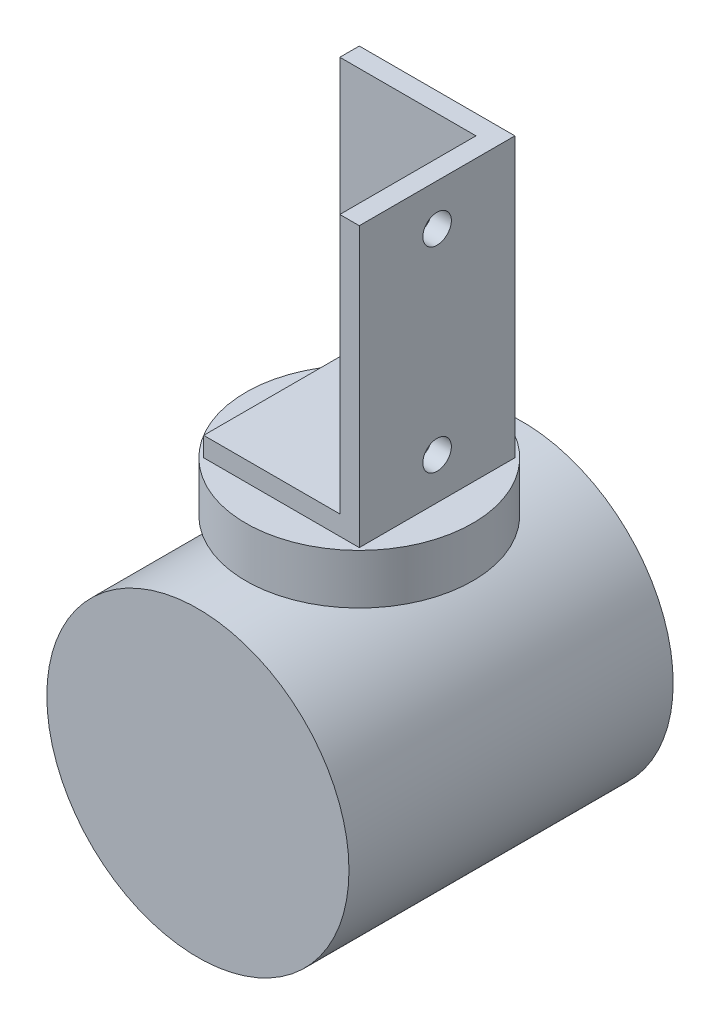
ISO-10303-21;
HEADER;
FILE_DESCRIPTION(('STEP AP214'),'2;1');
FILE_NAME('part.step','',(''),(''),'','','');
FILE_SCHEMA(('AUTOMOTIVE_DESIGN { 1 0 10303 214 1 1 1 1 }'));
ENDSEC;
DATA;
#1=APPLICATION_CONTEXT('core data for automotive mechanical design processes');
#2=APPLICATION_PROTOCOL_DEFINITION('international standard','automotive_design',2000,#1);
#3=PRODUCT_CONTEXT('',#1,'mechanical');
#4=PRODUCT('Part','Part','',(#3));
#5=PRODUCT_RELATED_PRODUCT_CATEGORY('part','',(#4));
#6=PRODUCT_DEFINITION_FORMATION('','',#4);
#7=PRODUCT_DEFINITION_CONTEXT('part definition',#1,'design');
#8=PRODUCT_DEFINITION('design','',#6,#7);
#9=PRODUCT_DEFINITION_SHAPE('','',#8);
#10=(LENGTH_UNIT() NAMED_UNIT(*) SI_UNIT(.MILLI.,.METRE.));
#11=(NAMED_UNIT(*) PLANE_ANGLE_UNIT() SI_UNIT($,.RADIAN.));
#12=(NAMED_UNIT(*) SI_UNIT($,.STERADIAN.) SOLID_ANGLE_UNIT());
#13=UNCERTAINTY_MEASURE_WITH_UNIT(LENGTH_MEASURE(1.E-05),#10,'distance_accuracy_value','');
#14=(GEOMETRIC_REPRESENTATION_CONTEXT(3) GLOBAL_UNCERTAINTY_ASSIGNED_CONTEXT((#13)) GLOBAL_UNIT_ASSIGNED_CONTEXT((#10,
#11,#12)) REPRESENTATION_CONTEXT('',''));
#15=CARTESIAN_POINT('',(0.,0.,0.));
#16=DIRECTION('',(0.,0.,1.));
#17=DIRECTION('',(1.,0.,0.));
#18=AXIS2_PLACEMENT_3D('',#15,#16,#17);
#19=CARTESIAN_POINT('',(0.,-39.37,31.6095157544582));
#20=DIRECTION('',(0.,0.,-1.));
#21=DIRECTION('',(-1.,0.,0.));
#22=AXIS2_PLACEMENT_3D('',#19,#20,#21);
#23=PLANE('',#22);
#24=CARTESIAN_POINT('',(0.,-39.37,31.6095157544582));
#25=DIRECTION('',(0.,0.,-1.));
#26=DIRECTION('',(-1.,0.,0.));
#27=AXIS2_PLACEMENT_3D('',#24,#25,#26);
#28=CIRCLE('',#27,29.591);
#29=CARTESIAN_POINT('',(-29.591,-39.37,31.6095157544582));
#30=VERTEX_POINT('',#29);
#31=EDGE_CURVE('E47',#30,#30,#28,.T.);
#32=ORIENTED_EDGE('',*,*,#31,.F.);
#33=EDGE_LOOP('',(#32));
#34=FACE_BOUND('',#33,.T.);
#35=ADVANCED_FACE('F41',(#34),#23,.F.);
#36=CARTESIAN_POINT('',(0.,-39.37,-31.8904842455418));
#37=DIRECTION('',(0.,0.,1.));
#38=DIRECTION('',(1.,0.,0.));
#39=AXIS2_PLACEMENT_3D('',#36,#37,#38);
#40=PLANE('',#39);
#41=CARTESIAN_POINT('',(0.,-39.37,-31.8904842455418));
#42=DIRECTION('',(0.,0.,-1.));
#43=DIRECTION('',(-1.,0.,0.));
#44=AXIS2_PLACEMENT_3D('',#41,#42,#43);
#45=CIRCLE('',#44,29.591);
#46=CARTESIAN_POINT('',(-29.591,-39.37,-31.8904842455418));
#47=VERTEX_POINT('',#46);
#48=EDGE_CURVE('E11',#47,#47,#45,.T.);
#49=ORIENTED_EDGE('',*,*,#48,.T.);
#50=EDGE_LOOP('',(#49));
#51=FACE_BOUND('',#50,.T.);
#52=ADVANCED_FACE('F56',(#51),#40,.F.);
#53=CARTESIAN_POINT('',(0.,-39.37,-31.8904842455418));
#54=DIRECTION('',(0.,0.,-1.));
#55=DIRECTION('',(-1.,0.,0.));
#56=AXIS2_PLACEMENT_3D('',#53,#54,#55);
#57=CYLINDRICAL_SURFACE('',#56,29.591);
#58=ORIENTED_EDGE('',*,*,#48,.F.);
#59=EDGE_LOOP('',(#58));
#60=FACE_BOUND('',#59,.T.);
#61=ORIENTED_EDGE('',*,*,#31,.T.);
#62=EDGE_LOOP('',(#61));
#63=FACE_BOUND('',#62,.T.);
#64=ADVANCED_FACE('F53',(#60,#63),#57,.T.);
#65=CLOSED_SHELL('',(#35,#52,#64));
#66=MANIFOLD_SOLID_BREP('B2',#65);
#67=CARTESIAN_POINT('',(15.24,3.81,-15.24));
#68=DIRECTION('',(-1.,0.,0.));
#69=DIRECTION('',(0.,0.,1.));
#70=AXIS2_PLACEMENT_3D('',#67,#68,#69);
#71=PLANE('',#70);
#72=CARTESIAN_POINT('',(15.24,8.128,0.));
#73=DIRECTION('',(1.,0.,0.));
#74=DIRECTION('',(0.,0.,-1.));
#75=AXIS2_PLACEMENT_3D('',#72,#73,#74);
#76=CIRCLE('',#75,2.794);
#77=CARTESIAN_POINT('',(15.24,8.128,-2.794));
#78=VERTEX_POINT('',#77);
#79=EDGE_CURVE('E249',#78,#78,#76,.T.);
#80=ORIENTED_EDGE('',*,*,#79,.F.);
#81=EDGE_LOOP('',(#80));
#82=FACE_BOUND('',#81,.T.);
#83=CARTESIAN_POINT('',(15.24,46.482,0.));
#84=DIRECTION('',(1.,0.,0.));
#85=DIRECTION('',(0.,0.,-1.));
#86=AXIS2_PLACEMENT_3D('',#83,#84,#85);
#87=CIRCLE('',#86,2.794);
#88=CARTESIAN_POINT('',(15.24,46.482,-2.794));
#89=VERTEX_POINT('',#88);
#90=EDGE_CURVE('E221',#89,#89,#87,.T.);
#91=ORIENTED_EDGE('',*,*,#90,.F.);
#92=EDGE_LOOP('',(#91));
#93=FACE_BOUND('',#92,.T.);
#94=DIRECTION('',(0.,0.,-1.));
#95=VECTOR('',#94,1.);
#96=CARTESIAN_POINT('',(15.24,0.,-15.24));
#97=LINE('',#96,#95);
#98=CARTESIAN_POINT('',(15.24,0.,15.24));
#99=VERTEX_POINT('',#98);
#100=CARTESIAN_POINT('',(15.24,0.,-15.24));
#101=VERTEX_POINT('',#100);
#102=EDGE_CURVE('E146',#99,#101,#97,.T.);
#103=ORIENTED_EDGE('',*,*,#102,.T.);
#104=DIRECTION('',(0.,-1.,0.));
#105=VECTOR('',#104,1.);
#106=CARTESIAN_POINT('',(15.24,3.81,-15.24));
#107=LINE('',#106,#105);
#108=CARTESIAN_POINT('',(15.24,54.61,-15.24));
#109=VERTEX_POINT('',#108);
#110=EDGE_CURVE('E39',#109,#101,#107,.T.);
#111=ORIENTED_EDGE('',*,*,#110,.F.);
#112=DIRECTION('',(0.,0.,-1.));
#113=VECTOR('',#112,1.);
#114=CARTESIAN_POINT('',(15.24,54.61,-11.43));
#115=LINE('',#114,#113);
#116=CARTESIAN_POINT('',(15.24,54.61,15.24));
#117=VERTEX_POINT('',#116);
#118=EDGE_CURVE('E187',#117,#109,#115,.T.);
#119=ORIENTED_EDGE('',*,*,#118,.F.);
#120=DIRECTION('',(0.,-1.,0.));
#121=VECTOR('',#120,1.);
#122=CARTESIAN_POINT('',(15.24,3.81,15.24));
#123=LINE('',#122,#121);
#124=EDGE_CURVE('E162',#117,#99,#123,.T.);
#125=ORIENTED_EDGE('',*,*,#124,.T.);
#126=EDGE_LOOP('',(#103,#111,#119,#125));
#127=FACE_BOUND('',#126,.T.);
#128=ADVANCED_FACE('F82',(#82,#93,#127),#71,.F.);
#129=CARTESIAN_POINT('',(-15.24,3.81,-15.24));
#130=DIRECTION('',(0.,0.,1.));
#131=DIRECTION('',(1.,0.,0.));
#132=AXIS2_PLACEMENT_3D('',#129,#130,#131);
#133=PLANE('',#132);
#134=DIRECTION('',(-1.,0.,0.));
#135=VECTOR('',#134,1.);
#136=CARTESIAN_POINT('',(-15.24,0.,-15.24));
#137=LINE('',#136,#135);
#138=CARTESIAN_POINT('',(-15.24,0.,-15.24));
#139=VERTEX_POINT('',#138);
#140=EDGE_CURVE('E158',#101,#139,#137,.T.);
#141=ORIENTED_EDGE('',*,*,#140,.T.);
#142=DIRECTION('',(0.,-1.,0.));
#143=VECTOR('',#142,1.);
#144=CARTESIAN_POINT('',(-15.24,3.81,-15.24));
#145=LINE('',#144,#143);
#146=CARTESIAN_POINT('',(-15.24,54.61,-15.24));
#147=VERTEX_POINT('',#146);
#148=EDGE_CURVE('E90',#147,#139,#145,.T.);
#149=ORIENTED_EDGE('',*,*,#148,.F.);
#150=DIRECTION('',(-1.,0.,0.));
#151=VECTOR('',#150,1.);
#152=CARTESIAN_POINT('',(11.43,54.61,-15.24));
#153=LINE('',#152,#151);
#154=EDGE_CURVE('E183',#109,#147,#153,.T.);
#155=ORIENTED_EDGE('',*,*,#154,.F.);
#156=ORIENTED_EDGE('',*,*,#110,.T.);
#157=EDGE_LOOP('',(#141,#149,#155,#156));
#158=FACE_BOUND('',#157,.T.);
#159=ADVANCED_FACE('F180',(#158),#133,.F.);
#160=CARTESIAN_POINT('',(-15.24,3.81,-15.24));
#161=DIRECTION('',(1.,0.,0.));
#162=DIRECTION('',(0.,0.,-1.));
#163=AXIS2_PLACEMENT_3D('',#160,#161,#162);
#164=PLANE('',#163);
#165=DIRECTION('',(0.,0.,1.));
#166=VECTOR('',#165,1.);
#167=CARTESIAN_POINT('',(-15.24,0.,-15.24));
#168=LINE('',#167,#166);
#169=CARTESIAN_POINT('',(-15.24,0.,15.24));
#170=VERTEX_POINT('',#169);
#171=EDGE_CURVE('E143',#139,#170,#168,.T.);
#172=ORIENTED_EDGE('',*,*,#171,.T.);
#173=DIRECTION('',(0.,-1.,0.));
#174=VECTOR('',#173,1.);
#175=CARTESIAN_POINT('',(-15.24,3.81,15.24));
#176=LINE('',#175,#174);
#177=CARTESIAN_POINT('',(-15.24,3.81,15.24));
#178=VERTEX_POINT('',#177);
#179=EDGE_CURVE('E156',#178,#170,#176,.T.);
#180=ORIENTED_EDGE('',*,*,#179,.F.);
#181=DIRECTION('',(0.,0.,1.));
#182=VECTOR('',#181,1.);
#183=CARTESIAN_POINT('',(-15.24,3.81,-15.24));
#184=LINE('',#183,#182);
#185=CARTESIAN_POINT('',(-15.24,3.81,-11.43));
#186=VERTEX_POINT('',#185);
#187=EDGE_CURVE('E150',#186,#178,#184,.T.);
#188=ORIENTED_EDGE('',*,*,#187,.F.);
#189=DIRECTION('',(0.,-1.,0.));
#190=VECTOR('',#189,1.);
#191=CARTESIAN_POINT('',(-15.24,54.61,-11.43));
#192=LINE('',#191,#190);
#193=CARTESIAN_POINT('',(-15.24,54.61,-11.43));
#194=VERTEX_POINT('',#193);
#195=EDGE_CURVE('E178',#194,#186,#192,.T.);
#196=ORIENTED_EDGE('',*,*,#195,.F.);
#197=DIRECTION('',(0.,0.,1.));
#198=VECTOR('',#197,1.);
#199=CARTESIAN_POINT('',(-15.24,54.61,-15.24));
#200=LINE('',#199,#198);
#201=EDGE_CURVE('E208',#147,#194,#200,.T.);
#202=ORIENTED_EDGE('',*,*,#201,.F.);
#203=ORIENTED_EDGE('',*,*,#148,.T.);
#204=EDGE_LOOP('',(#172,#180,#188,#196,#202,#203));
#205=FACE_BOUND('',#204,.T.);
#206=ADVANCED_FACE('F155',(#205),#164,.F.);
#207=CARTESIAN_POINT('',(-15.24,3.81,15.24));
#208=DIRECTION('',(0.,0.,-1.));
#209=DIRECTION('',(-1.,0.,0.));
#210=AXIS2_PLACEMENT_3D('',#207,#208,#209);
#211=PLANE('',#210);
#212=DIRECTION('',(1.,0.,0.));
#213=VECTOR('',#212,1.);
#214=CARTESIAN_POINT('',(-15.24,0.,15.24));
#215=LINE('',#214,#213);
#216=EDGE_CURVE('E140',#170,#99,#215,.T.);
#217=ORIENTED_EDGE('',*,*,#216,.T.);
#218=ORIENTED_EDGE('',*,*,#124,.F.);
#219=DIRECTION('',(1.,0.,0.));
#220=VECTOR('',#219,1.);
#221=CARTESIAN_POINT('',(15.24,54.61,15.24));
#222=LINE('',#221,#220);
#223=CARTESIAN_POINT('',(11.43,54.61,15.24));
#224=VERTEX_POINT('',#223);
#225=EDGE_CURVE('E190',#224,#117,#222,.T.);
#226=ORIENTED_EDGE('',*,*,#225,.F.);
#227=DIRECTION('',(0.,-1.,0.));
#228=VECTOR('',#227,1.);
#229=CARTESIAN_POINT('',(11.43,54.61,15.24));
#230=LINE('',#229,#228);
#231=CARTESIAN_POINT('',(11.43,3.81,15.24));
#232=VERTEX_POINT('',#231);
#233=EDGE_CURVE('E203',#224,#232,#230,.T.);
#234=ORIENTED_EDGE('',*,*,#233,.T.);
#235=DIRECTION('',(1.,0.,0.));
#236=VECTOR('',#235,1.);
#237=CARTESIAN_POINT('',(-15.24,3.81,15.24));
#238=LINE('',#237,#236);
#239=EDGE_CURVE('E98',#178,#232,#238,.T.);
#240=ORIENTED_EDGE('',*,*,#239,.F.);
#241=ORIENTED_EDGE('',*,*,#179,.T.);
#242=EDGE_LOOP('',(#217,#218,#226,#234,#240,#241));
#243=FACE_BOUND('',#242,.T.);
#244=ADVANCED_FACE('F160',(#243),#211,.F.);
#245=CARTESIAN_POINT('',(0.,3.81,0.));
#246=DIRECTION('',(0.,1.,0.));
#247=DIRECTION('',(0.,0.,1.));
#248=AXIS2_PLACEMENT_3D('',#245,#246,#247);
#249=PLANE('',#248);
#250=DIRECTION('',(0.,0.,1.));
#251=VECTOR('',#250,1.);
#252=CARTESIAN_POINT('',(11.43,3.81,-11.43));
#253=LINE('',#252,#251);
#254=CARTESIAN_POINT('',(11.43,3.81,-11.43));
#255=VERTEX_POINT('',#254);
#256=EDGE_CURVE('E206',#255,#232,#253,.T.);
#257=ORIENTED_EDGE('',*,*,#256,.F.);
#258=DIRECTION('',(1.,0.,0.));
#259=VECTOR('',#258,1.);
#260=CARTESIAN_POINT('',(-15.24,3.81,-11.43));
#261=LINE('',#260,#259);
#262=EDGE_CURVE('E103',#186,#255,#261,.T.);
#263=ORIENTED_EDGE('',*,*,#262,.F.);
#264=ORIENTED_EDGE('',*,*,#187,.T.);
#265=ORIENTED_EDGE('',*,*,#239,.T.);
#266=EDGE_LOOP('',(#257,#263,#264,#265));
#267=FACE_BOUND('',#266,.T.);
#268=ADVANCED_FACE('F232',(#267),#249,.T.);
#269=CARTESIAN_POINT('',(-15.24,54.61,-11.43));
#270=DIRECTION('',(0.,0.,-1.));
#271=DIRECTION('',(-1.,0.,0.));
#272=AXIS2_PLACEMENT_3D('',#269,#270,#271);
#273=PLANE('',#272);
#274=ORIENTED_EDGE('',*,*,#262,.T.);
#275=DIRECTION('',(0.,-1.,0.));
#276=VECTOR('',#275,1.);
#277=CARTESIAN_POINT('',(11.43,54.61,-11.43));
#278=LINE('',#277,#276);
#279=CARTESIAN_POINT('',(11.43,54.61,-11.43));
#280=VERTEX_POINT('',#279);
#281=EDGE_CURVE('E173',#280,#255,#278,.T.);
#282=ORIENTED_EDGE('',*,*,#281,.F.);
#283=DIRECTION('',(1.,0.,0.));
#284=VECTOR('',#283,1.);
#285=CARTESIAN_POINT('',(-15.24,54.61,-11.43));
#286=LINE('',#285,#284);
#287=EDGE_CURVE('E199',#194,#280,#286,.T.);
#288=ORIENTED_EDGE('',*,*,#287,.F.);
#289=ORIENTED_EDGE('',*,*,#195,.T.);
#290=EDGE_LOOP('',(#274,#282,#288,#289));
#291=FACE_BOUND('',#290,.T.);
#292=ADVANCED_FACE('F230',(#291),#273,.F.);
#293=CARTESIAN_POINT('',(11.43,54.61,-11.43));
#294=DIRECTION('',(1.,0.,0.));
#295=DIRECTION('',(0.,0.,-1.));
#296=AXIS2_PLACEMENT_3D('',#293,#294,#295);
#297=PLANE('',#296);
#298=CARTESIAN_POINT('',(11.43,8.128,0.));
#299=DIRECTION('',(1.,0.,0.));
#300=DIRECTION('',(0.,0.,-1.));
#301=AXIS2_PLACEMENT_3D('',#298,#299,#300);
#302=CIRCLE('',#301,2.794);
#303=CARTESIAN_POINT('',(11.43,8.128,-2.794));
#304=VERTEX_POINT('',#303);
#305=EDGE_CURVE('E226',#304,#304,#302,.F.);
#306=ORIENTED_EDGE('',*,*,#305,.F.);
#307=EDGE_LOOP('',(#306));
#308=FACE_BOUND('',#307,.T.);
#309=CARTESIAN_POINT('',(11.43,46.482,0.));
#310=DIRECTION('',(1.,0.,0.));
#311=DIRECTION('',(0.,0.,-1.));
#312=AXIS2_PLACEMENT_3D('',#309,#310,#311);
#313=CIRCLE('',#312,2.794);
#314=CARTESIAN_POINT('',(11.43,46.482,-2.794));
#315=VERTEX_POINT('',#314);
#316=EDGE_CURVE('E219',#315,#315,#313,.F.);
#317=ORIENTED_EDGE('',*,*,#316,.F.);
#318=EDGE_LOOP('',(#317));
#319=FACE_BOUND('',#318,.T.);
#320=ORIENTED_EDGE('',*,*,#256,.T.);
#321=ORIENTED_EDGE('',*,*,#233,.F.);
#322=DIRECTION('',(0.,0.,1.));
#323=VECTOR('',#322,1.);
#324=CARTESIAN_POINT('',(11.43,54.61,-11.43));
#325=LINE('',#324,#323);
#326=EDGE_CURVE('E195',#280,#224,#325,.T.);
#327=ORIENTED_EDGE('',*,*,#326,.F.);
#328=ORIENTED_EDGE('',*,*,#281,.T.);
#329=EDGE_LOOP('',(#320,#321,#327,#328));
#330=FACE_BOUND('',#329,.T.);
#331=ADVANCED_FACE('F231',(#308,#319,#330),#297,.F.);
#332=CARTESIAN_POINT('',(0.,54.61,0.));
#333=DIRECTION('',(0.,1.,0.));
#334=DIRECTION('',(0.,0.,1.));
#335=AXIS2_PLACEMENT_3D('',#332,#333,#334);
#336=PLANE('',#335);
#337=ORIENTED_EDGE('',*,*,#201,.T.);
#338=ORIENTED_EDGE('',*,*,#287,.T.);
#339=ORIENTED_EDGE('',*,*,#326,.T.);
#340=ORIENTED_EDGE('',*,*,#225,.T.);
#341=ORIENTED_EDGE('',*,*,#118,.T.);
#342=ORIENTED_EDGE('',*,*,#154,.T.);
#343=EDGE_LOOP('',(#337,#338,#339,#340,#341,#342));
#344=FACE_BOUND('',#343,.T.);
#345=ADVANCED_FACE('F193',(#344),#336,.T.);
#346=CARTESIAN_POINT('',(3.52737461345915,46.482,0.));
#347=DIRECTION('',(1.,0.,0.));
#348=DIRECTION('',(0.,0.,-1.));
#349=AXIS2_PLACEMENT_3D('',#346,#347,#348);
#350=CYLINDRICAL_SURFACE('',#349,2.794);
#351=ORIENTED_EDGE('',*,*,#316,.T.);
#352=EDGE_LOOP('',(#351));
#353=FACE_BOUND('',#352,.T.);
#354=ORIENTED_EDGE('',*,*,#90,.T.);
#355=EDGE_LOOP('',(#354));
#356=FACE_BOUND('',#355,.T.);
#357=ADVANCED_FACE('F252',(#353,#356),#350,.F.);
#358=CARTESIAN_POINT('',(3.52737461345915,8.128,0.));
#359=DIRECTION('',(1.,0.,0.));
#360=DIRECTION('',(0.,0.,-1.));
#361=AXIS2_PLACEMENT_3D('',#358,#359,#360);
#362=CYLINDRICAL_SURFACE('',#361,2.794);
#363=ORIENTED_EDGE('',*,*,#305,.T.);
#364=EDGE_LOOP('',(#363));
#365=FACE_BOUND('',#364,.T.);
#366=ORIENTED_EDGE('',*,*,#79,.T.);
#367=EDGE_LOOP('',(#366));
#368=FACE_BOUND('',#367,.T.);
#369=ADVANCED_FACE('F254',(#365,#368),#362,.F.);
#370=CARTESIAN_POINT('',(0.,0.,0.));
#371=DIRECTION('',(0.,-1.,0.));
#372=DIRECTION('',(0.,0.,-1.));
#373=AXIS2_PLACEMENT_3D('',#370,#371,#372);
#374=PLANE('',#373);
#375=CARTESIAN_POINT('',(0.,0.,0.));
#376=DIRECTION('',(0.,-1.,0.));
#377=DIRECTION('',(0.,0.,-1.));
#378=AXIS2_PLACEMENT_3D('',#375,#376,#377);
#379=CIRCLE('',#378,22.225);
#380=CARTESIAN_POINT('',(0.,0.,-22.225));
#381=VERTEX_POINT('',#380);
#382=EDGE_CURVE('E275',#381,#381,#379,.T.);
#383=ORIENTED_EDGE('',*,*,#382,.F.);
#384=EDGE_LOOP('',(#383));
#385=FACE_BOUND('',#384,.T.);
#386=ORIENTED_EDGE('',*,*,#140,.F.);
#387=ORIENTED_EDGE('',*,*,#102,.F.);
#388=ORIENTED_EDGE('',*,*,#216,.F.);
#389=ORIENTED_EDGE('',*,*,#171,.F.);
#390=EDGE_LOOP('',(#386,#387,#388,#389));
#391=FACE_BOUND('',#390,.T.);
#392=ADVANCED_FACE('F142',(#385,#391),#374,.F.);
#393=CARTESIAN_POINT('',(0.,-9.779,0.));
#394=DIRECTION('',(0.,1.,0.));
#395=DIRECTION('',(0.,0.,1.));
#396=AXIS2_PLACEMENT_3D('',#393,#394,#395);
#397=CYLINDRICAL_SURFACE('',#396,22.225);
#398=CARTESIAN_POINT('',(0.,-9.779,0.));
#399=DIRECTION('',(0.,-1.,0.));
#400=DIRECTION('',(0.,0.,-1.));
#401=AXIS2_PLACEMENT_3D('',#398,#399,#400);
#402=CIRCLE('',#401,22.225);
#403=CARTESIAN_POINT('',(0.,-9.779,-22.225));
#404=VERTEX_POINT('',#403);
#405=EDGE_CURVE('E272',#404,#404,#402,.T.);
#406=ORIENTED_EDGE('',*,*,#405,.F.);
#407=EDGE_LOOP('',(#406));
#408=FACE_BOUND('',#407,.T.);
#409=ORIENTED_EDGE('',*,*,#382,.T.);
#410=EDGE_LOOP('',(#409));
#411=FACE_BOUND('',#410,.T.);
#412=ADVANCED_FACE('F283',(#408,#411),#397,.T.);
#413=CARTESIAN_POINT('',(0.,-9.779,0.));
#414=DIRECTION('',(0.,-1.,0.));
#415=DIRECTION('',(0.,0.,-1.));
#416=AXIS2_PLACEMENT_3D('',#413,#414,#415);
#417=PLANE('',#416);
#418=ORIENTED_EDGE('',*,*,#405,.T.);
#419=EDGE_LOOP('',(#418));
#420=FACE_BOUND('',#419,.T.);
#421=ADVANCED_FACE('F281',(#420),#417,.T.);
#422=CLOSED_SHELL('',(#128,#159,#206,#244,#268,#292,#331,#345,#357,#369,#392,#412,#421));
#423=MANIFOLD_SOLID_BREP('B6',#422);
#424=ADVANCED_BREP_SHAPE_REPRESENTATION('',(#18,#66,#423),#14);
#425=SHAPE_DEFINITION_REPRESENTATION(#9,#424);
ENDSEC;
END-ISO-10303-21;
